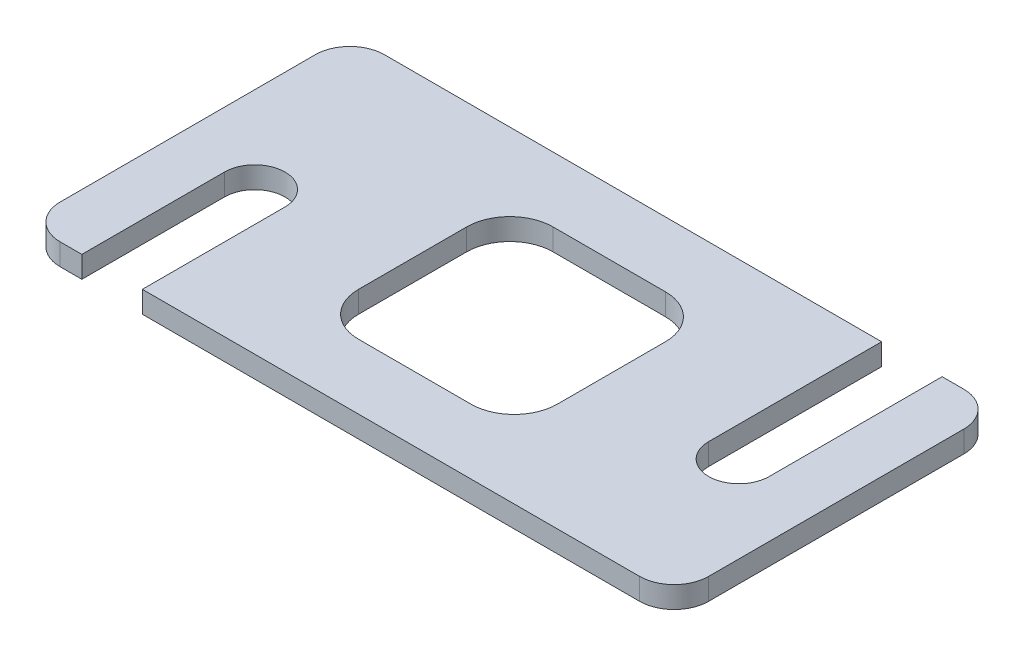
ISO-10303-21;
HEADER;
FILE_DESCRIPTION(('STEP AP214'),'2;1');
FILE_NAME('part.step','',(''),(''),'','','');
FILE_SCHEMA(('AUTOMOTIVE_DESIGN { 1 0 10303 214 1 1 1 1 }'));
ENDSEC;
DATA;
#1=APPLICATION_CONTEXT('core data for automotive mechanical design processes');
#2=APPLICATION_PROTOCOL_DEFINITION('international standard','automotive_design',2000,#1);
#3=PRODUCT_CONTEXT('',#1,'mechanical');
#4=PRODUCT('Part','Part','',(#3));
#5=PRODUCT_RELATED_PRODUCT_CATEGORY('part','',(#4));
#6=PRODUCT_DEFINITION_FORMATION('','',#4);
#7=PRODUCT_DEFINITION_CONTEXT('part definition',#1,'design');
#8=PRODUCT_DEFINITION('design','',#6,#7);
#9=PRODUCT_DEFINITION_SHAPE('','',#8);
#10=(LENGTH_UNIT() NAMED_UNIT(*) SI_UNIT(.MILLI.,.METRE.));
#11=(NAMED_UNIT(*) PLANE_ANGLE_UNIT() SI_UNIT($,.RADIAN.));
#12=(NAMED_UNIT(*) SI_UNIT($,.STERADIAN.) SOLID_ANGLE_UNIT());
#13=UNCERTAINTY_MEASURE_WITH_UNIT(LENGTH_MEASURE(1.E-05),#10,'distance_accuracy_value','');
#14=(GEOMETRIC_REPRESENTATION_CONTEXT(3) GLOBAL_UNCERTAINTY_ASSIGNED_CONTEXT((#13)) GLOBAL_UNIT_ASSIGNED_CONTEXT((#10,
#11,#12)) REPRESENTATION_CONTEXT('',''));
#15=CARTESIAN_POINT('',(0.,0.,0.));
#16=DIRECTION('',(0.,0.,1.));
#17=DIRECTION('',(1.,0.,0.));
#18=AXIS2_PLACEMENT_3D('',#15,#16,#17);
#19=CARTESIAN_POINT('',(0.,5.,-75.));
#20=DIRECTION('',(0.,0.,1.));
#21=DIRECTION('',(1.,0.,0.));
#22=AXIS2_PLACEMENT_3D('',#19,#20,#21);
#23=PLANE('',#22);
#24=DIRECTION('',(-1.,0.,0.));
#25=VECTOR('',#24,1.);
#26=CARTESIAN_POINT('',(0.,5.,-75.));
#27=LINE('',#26,#25);
#28=CARTESIAN_POINT('',(142.,5.,-75.));
#29=VERTEX_POINT('',#28);
#30=CARTESIAN_POINT('',(137.,5.,-75.));
#31=VERTEX_POINT('',#30);
#32=EDGE_CURVE('E248',#29,#31,#27,.T.);
#33=ORIENTED_EDGE('',*,*,#32,.F.);
#34=DIRECTION('',(0.,-1.,0.));
#35=VECTOR('',#34,1.);
#36=CARTESIAN_POINT('',(142.,5.,-75.));
#37=LINE('',#36,#35);
#38=CARTESIAN_POINT('',(142.,0.,-75.));
#39=VERTEX_POINT('',#38);
#40=EDGE_CURVE('E11',#29,#39,#37,.T.);
#41=ORIENTED_EDGE('',*,*,#40,.T.);
#42=DIRECTION('',(-1.,0.,0.));
#43=VECTOR('',#42,1.);
#44=CARTESIAN_POINT('',(0.,0.,-75.));
#45=LINE('',#44,#43);
#46=CARTESIAN_POINT('',(137.,0.,-75.));
#47=VERTEX_POINT('',#46);
#48=EDGE_CURVE('E233',#39,#47,#45,.T.);
#49=ORIENTED_EDGE('',*,*,#48,.T.);
#50=DIRECTION('',(0.,1.,0.));
#51=VECTOR('',#50,1.);
#52=CARTESIAN_POINT('',(137.,0.,-75.));
#53=LINE('',#52,#51);
#54=EDGE_CURVE('E395',#47,#31,#53,.T.);
#55=ORIENTED_EDGE('',*,*,#54,.T.);
#56=EDGE_LOOP('',(#33,#41,#49,#55));
#57=FACE_BOUND('',#56,.T.);
#58=ADVANCED_FACE('F39',(#57),#23,.F.);
#59=CARTESIAN_POINT('',(0.,5.,0.));
#60=DIRECTION('',(0.,0.,-1.));
#61=DIRECTION('',(-1.,0.,0.));
#62=AXIS2_PLACEMENT_3D('',#59,#60,#61);
#63=PLANE('',#62);
#64=DIRECTION('',(1.,0.,0.));
#65=VECTOR('',#64,1.);
#66=CARTESIAN_POINT('',(0.,5.,0.));
#67=LINE('',#66,#65);
#68=CARTESIAN_POINT('',(8.,5.,0.));
#69=VERTEX_POINT('',#68);
#70=CARTESIAN_POINT('',(13.,5.,0.));
#71=VERTEX_POINT('',#70);
#72=EDGE_CURVE('E345',#69,#71,#67,.T.);
#73=ORIENTED_EDGE('',*,*,#72,.F.);
#74=DIRECTION('',(0.,-1.,0.));
#75=VECTOR('',#74,1.);
#76=CARTESIAN_POINT('',(8.,5.,0.));
#77=LINE('',#76,#75);
#78=CARTESIAN_POINT('',(8.,0.,0.));
#79=VERTEX_POINT('',#78);
#80=EDGE_CURVE('E48',#69,#79,#77,.T.);
#81=ORIENTED_EDGE('',*,*,#80,.T.);
#82=DIRECTION('',(1.,0.,0.));
#83=VECTOR('',#82,1.);
#84=CARTESIAN_POINT('',(0.,0.,0.));
#85=LINE('',#84,#83);
#86=CARTESIAN_POINT('',(13.,0.,0.));
#87=VERTEX_POINT('',#86);
#88=EDGE_CURVE('E240',#79,#87,#85,.T.);
#89=ORIENTED_EDGE('',*,*,#88,.T.);
#90=DIRECTION('',(0.,1.,0.));
#91=VECTOR('',#90,1.);
#92=CARTESIAN_POINT('',(13.,0.,0.));
#93=LINE('',#92,#91);
#94=EDGE_CURVE('E359',#87,#71,#93,.T.);
#95=ORIENTED_EDGE('',*,*,#94,.T.);
#96=EDGE_LOOP('',(#73,#81,#89,#95));
#97=FACE_BOUND('',#96,.T.);
#98=ADVANCED_FACE('F342',(#97),#63,.F.);
#99=CARTESIAN_POINT('',(0.,5.,0.));
#100=DIRECTION('',(1.,0.,0.));
#101=DIRECTION('',(0.,0.,-1.));
#102=AXIS2_PLACEMENT_3D('',#99,#100,#101);
#103=PLANE('',#102);
#104=DIRECTION('',(0.,0.,1.));
#105=VECTOR('',#104,1.);
#106=CARTESIAN_POINT('',(0.,5.,0.));
#107=LINE('',#106,#105);
#108=CARTESIAN_POINT('',(0.,5.,-67.));
#109=VERTEX_POINT('',#108);
#110=CARTESIAN_POINT('',(0.,5.,-8.));
#111=VERTEX_POINT('',#110);
#112=EDGE_CURVE('E238',#109,#111,#107,.T.);
#113=ORIENTED_EDGE('',*,*,#112,.F.);
#114=DIRECTION('',(0.,-1.,0.));
#115=VECTOR('',#114,1.);
#116=CARTESIAN_POINT('',(0.,5.,-67.));
#117=LINE('',#116,#115);
#118=CARTESIAN_POINT('',(0.,0.,-67.));
#119=VERTEX_POINT('',#118);
#120=EDGE_CURVE('E331',#109,#119,#117,.T.);
#121=ORIENTED_EDGE('',*,*,#120,.T.);
#122=DIRECTION('',(0.,0.,1.));
#123=VECTOR('',#122,1.);
#124=CARTESIAN_POINT('',(0.,0.,0.));
#125=LINE('',#124,#123);
#126=CARTESIAN_POINT('',(0.,0.,-8.));
#127=VERTEX_POINT('',#126);
#128=EDGE_CURVE('E355',#119,#127,#125,.T.);
#129=ORIENTED_EDGE('',*,*,#128,.T.);
#130=DIRECTION('',(0.,-1.,0.));
#131=VECTOR('',#130,1.);
#132=CARTESIAN_POINT('',(0.,5.,-8.));
#133=LINE('',#132,#131);
#134=EDGE_CURVE('E63',#127,#111,#133,.F.);
#135=ORIENTED_EDGE('',*,*,#134,.T.);
#136=EDGE_LOOP('',(#113,#121,#129,#135));
#137=FACE_BOUND('',#136,.T.);
#138=ADVANCED_FACE('F514',(#137),#103,.F.);
#139=CARTESIAN_POINT('',(27.,0.,0.));
#140=VERTEX_POINT('',#139);
#141=CARTESIAN_POINT('',(142.,0.,0.));
#142=VERTEX_POINT('',#141);
#143=EDGE_CURVE('E352',#140,#142,#85,.T.);
#144=ORIENTED_EDGE('',*,*,#143,.T.);
#145=DIRECTION('',(0.,-1.,0.));
#146=VECTOR('',#145,1.);
#147=CARTESIAN_POINT('',(142.,5.,0.));
#148=LINE('',#147,#146);
#149=CARTESIAN_POINT('',(142.,5.,0.));
#150=VERTEX_POINT('',#149);
#151=EDGE_CURVE('E315',#142,#150,#148,.F.);
#152=ORIENTED_EDGE('',*,*,#151,.T.);
#153=CARTESIAN_POINT('',(27.,5.,0.));
#154=VERTEX_POINT('',#153);
#155=EDGE_CURVE('E368',#154,#150,#67,.T.);
#156=ORIENTED_EDGE('',*,*,#155,.F.);
#157=DIRECTION('',(0.,1.,0.));
#158=VECTOR('',#157,1.);
#159=CARTESIAN_POINT('',(27.,0.,0.));
#160=LINE('',#159,#158);
#161=EDGE_CURVE('E371',#140,#154,#160,.T.);
#162=ORIENTED_EDGE('',*,*,#161,.F.);
#163=EDGE_LOOP('',(#144,#152,#156,#162));
#164=FACE_BOUND('',#163,.T.);
#165=ADVANCED_FACE('F516',(#164),#63,.F.);
#166=CARTESIAN_POINT('',(150.,5.,0.));
#167=DIRECTION('',(-1.,0.,0.));
#168=DIRECTION('',(0.,0.,1.));
#169=AXIS2_PLACEMENT_3D('',#166,#167,#168);
#170=PLANE('',#169);
#171=DIRECTION('',(0.,0.,-1.));
#172=VECTOR('',#171,1.);
#173=CARTESIAN_POINT('',(150.,5.,0.));
#174=LINE('',#173,#172);
#175=CARTESIAN_POINT('',(150.,5.,-8.));
#176=VERTEX_POINT('',#175);
#177=CARTESIAN_POINT('',(150.,5.,-67.));
#178=VERTEX_POINT('',#177);
#179=EDGE_CURVE('E362',#176,#178,#174,.T.);
#180=ORIENTED_EDGE('',*,*,#179,.F.);
#181=DIRECTION('',(0.,-1.,0.));
#182=VECTOR('',#181,1.);
#183=CARTESIAN_POINT('',(150.,5.,-8.));
#184=LINE('',#183,#182);
#185=CARTESIAN_POINT('',(150.,0.,-8.));
#186=VERTEX_POINT('',#185);
#187=EDGE_CURVE('E300',#176,#186,#184,.T.);
#188=ORIENTED_EDGE('',*,*,#187,.T.);
#189=DIRECTION('',(0.,0.,-1.));
#190=VECTOR('',#189,1.);
#191=CARTESIAN_POINT('',(150.,0.,0.));
#192=LINE('',#191,#190);
#193=CARTESIAN_POINT('',(150.,0.,-67.));
#194=VERTEX_POINT('',#193);
#195=EDGE_CURVE('E234',#186,#194,#192,.T.);
#196=ORIENTED_EDGE('',*,*,#195,.T.);
#197=DIRECTION('',(0.,-1.,0.));
#198=VECTOR('',#197,1.);
#199=CARTESIAN_POINT('',(150.,5.,-67.));
#200=LINE('',#199,#198);
#201=EDGE_CURVE('E297',#194,#178,#200,.F.);
#202=ORIENTED_EDGE('',*,*,#201,.T.);
#203=EDGE_LOOP('',(#180,#188,#196,#202));
#204=FACE_BOUND('',#203,.T.);
#205=ADVANCED_FACE('F521',(#204),#170,.F.);
#206=CARTESIAN_POINT('',(123.,0.,-75.));
#207=VERTEX_POINT('',#206);
#208=CARTESIAN_POINT('',(8.,0.,-75.));
#209=VERTEX_POINT('',#208);
#210=EDGE_CURVE('E221',#207,#209,#45,.T.);
#211=ORIENTED_EDGE('',*,*,#210,.T.);
#212=DIRECTION('',(0.,-1.,0.));
#213=VECTOR('',#212,1.);
#214=CARTESIAN_POINT('',(8.,5.,-75.));
#215=LINE('',#214,#213);
#216=CARTESIAN_POINT('',(8.,5.,-75.));
#217=VERTEX_POINT('',#216);
#218=EDGE_CURVE('E335',#209,#217,#215,.F.);
#219=ORIENTED_EDGE('',*,*,#218,.T.);
#220=CARTESIAN_POINT('',(123.,5.,-75.));
#221=VERTEX_POINT('',#220);
#222=EDGE_CURVE('E224',#221,#217,#27,.T.);
#223=ORIENTED_EDGE('',*,*,#222,.F.);
#224=DIRECTION('',(0.,1.,0.));
#225=VECTOR('',#224,1.);
#226=CARTESIAN_POINT('',(123.,0.,-75.));
#227=LINE('',#226,#225);
#228=EDGE_CURVE('E207',#207,#221,#227,.T.);
#229=ORIENTED_EDGE('',*,*,#228,.F.);
#230=EDGE_LOOP('',(#211,#219,#223,#229));
#231=FACE_BOUND('',#230,.T.);
#232=ADVANCED_FACE('F220',(#231),#23,.F.);
#233=CARTESIAN_POINT('',(0.,5.,0.));
#234=DIRECTION('',(0.,-1.,0.));
#235=DIRECTION('',(0.,0.,-1.));
#236=AXIS2_PLACEMENT_3D('',#233,#234,#235);
#237=PLANE('',#236);
#238=DIRECTION('',(1.,0.,0.));
#239=VECTOR('',#238,1.);
#240=CARTESIAN_POINT('',(52.,5.,-15.));
#241=LINE('',#240,#239);
#242=CARTESIAN_POINT('',(62.,5.,-15.));
#243=VERTEX_POINT('',#242);
#244=CARTESIAN_POINT('',(88.,5.,-15.));
#245=VERTEX_POINT('',#244);
#246=EDGE_CURVE('E437',#243,#245,#241,.T.);
#247=ORIENTED_EDGE('',*,*,#246,.F.);
#248=CARTESIAN_POINT('',(62.,5.,-25.));
#249=DIRECTION('',(0.,-1.,0.));
#250=DIRECTION('',(0.,0.,-1.));
#251=AXIS2_PLACEMENT_3D('',#248,#249,#250);
#252=CIRCLE('',#251,10.);
#253=CARTESIAN_POINT('',(52.,5.,-25.));
#254=VERTEX_POINT('',#253);
#255=EDGE_CURVE('E279',#243,#254,#252,.T.);
#256=ORIENTED_EDGE('',*,*,#255,.T.);
#257=DIRECTION('',(0.,0.,1.));
#258=VECTOR('',#257,1.);
#259=CARTESIAN_POINT('',(52.,5.,-15.));
#260=LINE('',#259,#258);
#261=CARTESIAN_POINT('',(52.,5.,-50.));
#262=VERTEX_POINT('',#261);
#263=EDGE_CURVE('E441',#262,#254,#260,.T.);
#264=ORIENTED_EDGE('',*,*,#263,.F.);
#265=CARTESIAN_POINT('',(62.,5.,-50.));
#266=DIRECTION('',(0.,-1.,0.));
#267=DIRECTION('',(0.,0.,-1.));
#268=AXIS2_PLACEMENT_3D('',#265,#266,#267);
#269=CIRCLE('',#268,10.);
#270=CARTESIAN_POINT('',(62.,5.,-60.));
#271=VERTEX_POINT('',#270);
#272=EDGE_CURVE('E273',#262,#271,#269,.T.);
#273=ORIENTED_EDGE('',*,*,#272,.T.);
#274=DIRECTION('',(-1.,0.,0.));
#275=VECTOR('',#274,1.);
#276=CARTESIAN_POINT('',(52.,5.,-60.));
#277=LINE('',#276,#275);
#278=CARTESIAN_POINT('',(88.,5.,-60.));
#279=VERTEX_POINT('',#278);
#280=EDGE_CURVE('E428',#279,#271,#277,.T.);
#281=ORIENTED_EDGE('',*,*,#280,.F.);
#282=CARTESIAN_POINT('',(88.,5.,-50.));
#283=DIRECTION('',(0.,-1.,0.));
#284=DIRECTION('',(0.,0.,-1.));
#285=AXIS2_PLACEMENT_3D('',#282,#283,#284);
#286=CIRCLE('',#285,10.);
#287=CARTESIAN_POINT('',(98.,5.,-50.));
#288=VERTEX_POINT('',#287);
#289=EDGE_CURVE('E291',#279,#288,#286,.T.);
#290=ORIENTED_EDGE('',*,*,#289,.T.);
#291=DIRECTION('',(0.,0.,-1.));
#292=VECTOR('',#291,1.);
#293=CARTESIAN_POINT('',(98.,5.,-15.));
#294=LINE('',#293,#292);
#295=CARTESIAN_POINT('',(98.,5.,-25.));
#296=VERTEX_POINT('',#295);
#297=EDGE_CURVE('E433',#296,#288,#294,.T.);
#298=ORIENTED_EDGE('',*,*,#297,.F.);
#299=CARTESIAN_POINT('',(88.,5.,-25.));
#300=DIRECTION('',(0.,-1.,0.));
#301=DIRECTION('',(0.,0.,-1.));
#302=AXIS2_PLACEMENT_3D('',#299,#300,#301);
#303=CIRCLE('',#302,10.);
#304=EDGE_CURVE('E285',#296,#245,#303,.T.);
#305=ORIENTED_EDGE('',*,*,#304,.T.);
#306=EDGE_LOOP('',(#247,#256,#264,#273,#281,#290,#298,#305));
#307=FACE_BOUND('',#306,.T.);
#308=ORIENTED_EDGE('',*,*,#155,.T.);
#309=CARTESIAN_POINT('',(142.,5.,-8.));
#310=DIRECTION('',(0.,-1.,0.));
#311=DIRECTION('',(0.,0.,-1.));
#312=AXIS2_PLACEMENT_3D('',#309,#310,#311);
#313=CIRCLE('',#312,8.);
#314=EDGE_CURVE('E326',#150,#176,#313,.F.);
#315=ORIENTED_EDGE('',*,*,#314,.T.);
#316=ORIENTED_EDGE('',*,*,#179,.T.);
#317=CARTESIAN_POINT('',(142.,5.,-67.));
#318=DIRECTION('',(0.,-1.,0.));
#319=DIRECTION('',(0.,0.,-1.));
#320=AXIS2_PLACEMENT_3D('',#317,#318,#319);
#321=CIRCLE('',#320,8.);
#322=EDGE_CURVE('E318',#178,#29,#321,.F.);
#323=ORIENTED_EDGE('',*,*,#322,.T.);
#324=ORIENTED_EDGE('',*,*,#32,.T.);
#325=DIRECTION('',(0.,0.,-1.));
#326=VECTOR('',#325,1.);
#327=CARTESIAN_POINT('',(137.,5.,-75.));
#328=LINE('',#327,#326);
#329=CARTESIAN_POINT('',(137.,5.,-35.));
#330=VERTEX_POINT('',#329);
#331=EDGE_CURVE('E215',#330,#31,#328,.T.);
#332=ORIENTED_EDGE('',*,*,#331,.F.);
#333=CARTESIAN_POINT('',(130.,5.,-35.));
#334=DIRECTION('',(0.,1.,0.));
#335=DIRECTION('',(0.,0.,-1.));
#336=AXIS2_PLACEMENT_3D('',#333,#334,#335);
#337=CIRCLE('',#336,7.00000000000001);
#338=CARTESIAN_POINT('',(123.,5.,-35.));
#339=VERTEX_POINT('',#338);
#340=EDGE_CURVE('E415',#339,#330,#337,.T.);
#341=ORIENTED_EDGE('',*,*,#340,.F.);
#342=DIRECTION('',(0.,0.,1.));
#343=VECTOR('',#342,1.);
#344=CARTESIAN_POINT('',(123.,5.,-35.));
#345=LINE('',#344,#343);
#346=EDGE_CURVE('E419',#221,#339,#345,.T.);
#347=ORIENTED_EDGE('',*,*,#346,.F.);
#348=ORIENTED_EDGE('',*,*,#222,.T.);
#349=CARTESIAN_POINT('',(8.,5.,-67.));
#350=DIRECTION('',(0.,-1.,0.));
#351=DIRECTION('',(0.,0.,-1.));
#352=AXIS2_PLACEMENT_3D('',#349,#350,#351);
#353=CIRCLE('',#352,8.);
#354=EDGE_CURVE('E323',#217,#109,#353,.F.);
#355=ORIENTED_EDGE('',*,*,#354,.T.);
#356=ORIENTED_EDGE('',*,*,#112,.T.);
#357=CARTESIAN_POINT('',(8.,5.,-8.));
#358=DIRECTION('',(0.,-1.,0.));
#359=DIRECTION('',(0.,0.,-1.));
#360=AXIS2_PLACEMENT_3D('',#357,#358,#359);
#361=CIRCLE('',#360,8.);
#362=EDGE_CURVE('E55',#111,#69,#361,.F.);
#363=ORIENTED_EDGE('',*,*,#362,.T.);
#364=ORIENTED_EDGE('',*,*,#72,.T.);
#365=DIRECTION('',(0.,0.,1.));
#366=VECTOR('',#365,1.);
#367=CARTESIAN_POINT('',(13.,5.,0.));
#368=LINE('',#367,#366);
#369=CARTESIAN_POINT('',(13.,5.,-33.));
#370=VERTEX_POINT('',#369);
#371=EDGE_CURVE('E382',#370,#71,#368,.T.);
#372=ORIENTED_EDGE('',*,*,#371,.F.);
#373=CARTESIAN_POINT('',(20.,5.,-33.));
#374=DIRECTION('',(0.,1.,0.));
#375=DIRECTION('',(0.,0.,-1.));
#376=AXIS2_PLACEMENT_3D('',#373,#374,#375);
#377=CIRCLE('',#376,7.);
#378=CARTESIAN_POINT('',(27.,5.,-33.));
#379=VERTEX_POINT('',#378);
#380=EDGE_CURVE('E387',#379,#370,#377,.T.);
#381=ORIENTED_EDGE('',*,*,#380,.F.);
#382=DIRECTION('',(0.,0.,-1.));
#383=VECTOR('',#382,1.);
#384=CARTESIAN_POINT('',(27.,5.,-33.));
#385=LINE('',#384,#383);
#386=EDGE_CURVE('E391',#154,#379,#385,.T.);
#387=ORIENTED_EDGE('',*,*,#386,.F.);
#388=EDGE_LOOP('',(#308,#315,#316,#323,#324,#332,#341,#347,#348,#355,#356,#363,#364,#372,#381,#387));
#389=FACE_BOUND('',#388,.T.);
#390=ADVANCED_FACE('F474',(#307,#389),#237,.F.);
#391=CARTESIAN_POINT('',(0.,0.,0.));
#392=DIRECTION('',(0.,-1.,0.));
#393=DIRECTION('',(0.,0.,-1.));
#394=AXIS2_PLACEMENT_3D('',#391,#392,#393);
#395=PLANE('',#394);
#396=DIRECTION('',(-1.,0.,0.));
#397=VECTOR('',#396,1.);
#398=CARTESIAN_POINT('',(52.,0.,-60.));
#399=LINE('',#398,#397);
#400=CARTESIAN_POINT('',(88.,0.,-60.));
#401=VERTEX_POINT('',#400);
#402=CARTESIAN_POINT('',(62.,0.,-60.));
#403=VERTEX_POINT('',#402);
#404=EDGE_CURVE('E422',#401,#403,#399,.T.);
#405=ORIENTED_EDGE('',*,*,#404,.T.);
#406=CARTESIAN_POINT('',(62.,0.,-50.));
#407=DIRECTION('',(0.,-1.,0.));
#408=DIRECTION('',(0.,0.,-1.));
#409=AXIS2_PLACEMENT_3D('',#406,#407,#408);
#410=CIRCLE('',#409,10.);
#411=CARTESIAN_POINT('',(52.,0.,-50.));
#412=VERTEX_POINT('',#411);
#413=EDGE_CURVE('E276',#403,#412,#410,.F.);
#414=ORIENTED_EDGE('',*,*,#413,.T.);
#415=DIRECTION('',(0.,0.,1.));
#416=VECTOR('',#415,1.);
#417=CARTESIAN_POINT('',(52.,0.,-15.));
#418=LINE('',#417,#416);
#419=CARTESIAN_POINT('',(52.,0.,-25.));
#420=VERTEX_POINT('',#419);
#421=EDGE_CURVE('E432',#412,#420,#418,.T.);
#422=ORIENTED_EDGE('',*,*,#421,.T.);
#423=CARTESIAN_POINT('',(62.,0.,-25.));
#424=DIRECTION('',(0.,-1.,0.));
#425=DIRECTION('',(0.,0.,-1.));
#426=AXIS2_PLACEMENT_3D('',#423,#424,#425);
#427=CIRCLE('',#426,10.);
#428=CARTESIAN_POINT('',(62.,0.,-15.));
#429=VERTEX_POINT('',#428);
#430=EDGE_CURVE('E282',#420,#429,#427,.F.);
#431=ORIENTED_EDGE('',*,*,#430,.T.);
#432=DIRECTION('',(1.,0.,0.));
#433=VECTOR('',#432,1.);
#434=CARTESIAN_POINT('',(52.,0.,-15.));
#435=LINE('',#434,#433);
#436=CARTESIAN_POINT('',(88.,0.,-15.));
#437=VERTEX_POINT('',#436);
#438=EDGE_CURVE('E452',#429,#437,#435,.T.);
#439=ORIENTED_EDGE('',*,*,#438,.T.);
#440=CARTESIAN_POINT('',(88.,0.,-25.));
#441=DIRECTION('',(0.,-1.,0.));
#442=DIRECTION('',(0.,0.,-1.));
#443=AXIS2_PLACEMENT_3D('',#440,#441,#442);
#444=CIRCLE('',#443,10.);
#445=CARTESIAN_POINT('',(98.,0.,-25.));
#446=VERTEX_POINT('',#445);
#447=EDGE_CURVE('E288',#437,#446,#444,.F.);
#448=ORIENTED_EDGE('',*,*,#447,.T.);
#449=DIRECTION('',(0.,0.,-1.));
#450=VECTOR('',#449,1.);
#451=CARTESIAN_POINT('',(98.,0.,-15.));
#452=LINE('',#451,#450);
#453=CARTESIAN_POINT('',(98.,0.,-50.));
#454=VERTEX_POINT('',#453);
#455=EDGE_CURVE('E448',#446,#454,#452,.T.);
#456=ORIENTED_EDGE('',*,*,#455,.T.);
#457=CARTESIAN_POINT('',(88.,0.,-50.));
#458=DIRECTION('',(0.,-1.,0.));
#459=DIRECTION('',(0.,0.,-1.));
#460=AXIS2_PLACEMENT_3D('',#457,#458,#459);
#461=CIRCLE('',#460,10.);
#462=EDGE_CURVE('E294',#454,#401,#461,.F.);
#463=ORIENTED_EDGE('',*,*,#462,.T.);
#464=EDGE_LOOP('',(#405,#414,#422,#431,#439,#448,#456,#463));
#465=FACE_BOUND('',#464,.T.);
#466=ORIENTED_EDGE('',*,*,#195,.F.);
#467=CARTESIAN_POINT('',(142.,0.,-8.));
#468=DIRECTION('',(0.,-1.,0.));
#469=DIRECTION('',(0.,0.,-1.));
#470=AXIS2_PLACEMENT_3D('',#467,#468,#469);
#471=CIRCLE('',#470,8.);
#472=EDGE_CURVE('E312',#186,#142,#471,.T.);
#473=ORIENTED_EDGE('',*,*,#472,.T.);
#474=ORIENTED_EDGE('',*,*,#143,.F.);
#475=DIRECTION('',(0.,0.,-1.));
#476=VECTOR('',#475,1.);
#477=CARTESIAN_POINT('',(27.,0.,-33.));
#478=LINE('',#477,#476);
#479=CARTESIAN_POINT('',(27.,0.,-33.));
#480=VERTEX_POINT('',#479);
#481=EDGE_CURVE('E386',#140,#480,#478,.T.);
#482=ORIENTED_EDGE('',*,*,#481,.T.);
#483=CARTESIAN_POINT('',(20.,0.,-33.));
#484=DIRECTION('',(0.,1.,0.));
#485=DIRECTION('',(0.,0.,-1.));
#486=AXIS2_PLACEMENT_3D('',#483,#484,#485);
#487=CIRCLE('',#486,7.);
#488=CARTESIAN_POINT('',(13.,0.,-33.));
#489=VERTEX_POINT('',#488);
#490=EDGE_CURVE('E398',#480,#489,#487,.T.);
#491=ORIENTED_EDGE('',*,*,#490,.T.);
#492=DIRECTION('',(0.,0.,1.));
#493=VECTOR('',#492,1.);
#494=CARTESIAN_POINT('',(13.,0.,0.));
#495=LINE('',#494,#493);
#496=EDGE_CURVE('E350',#489,#87,#495,.T.);
#497=ORIENTED_EDGE('',*,*,#496,.T.);
#498=ORIENTED_EDGE('',*,*,#88,.F.);
#499=CARTESIAN_POINT('',(8.,0.,-8.));
#500=DIRECTION('',(0.,-1.,0.));
#501=DIRECTION('',(0.,0.,-1.));
#502=AXIS2_PLACEMENT_3D('',#499,#500,#501);
#503=CIRCLE('',#502,8.);
#504=EDGE_CURVE('E307',#79,#127,#503,.T.);
#505=ORIENTED_EDGE('',*,*,#504,.T.);
#506=ORIENTED_EDGE('',*,*,#128,.F.);
#507=CARTESIAN_POINT('',(8.,0.,-67.));
#508=DIRECTION('',(0.,-1.,0.));
#509=DIRECTION('',(0.,0.,-1.));
#510=AXIS2_PLACEMENT_3D('',#507,#508,#509);
#511=CIRCLE('',#510,8.);
#512=EDGE_CURVE('E231',#119,#209,#511,.T.);
#513=ORIENTED_EDGE('',*,*,#512,.T.);
#514=ORIENTED_EDGE('',*,*,#210,.F.);
#515=DIRECTION('',(0.,0.,1.));
#516=VECTOR('',#515,1.);
#517=CARTESIAN_POINT('',(123.,0.,-35.));
#518=LINE('',#517,#516);
#519=CARTESIAN_POINT('',(123.,0.,-35.));
#520=VERTEX_POINT('',#519);
#521=EDGE_CURVE('E203',#207,#520,#518,.T.);
#522=ORIENTED_EDGE('',*,*,#521,.T.);
#523=CARTESIAN_POINT('',(130.,0.,-35.));
#524=DIRECTION('',(0.,1.,0.));
#525=DIRECTION('',(0.,0.,-1.));
#526=AXIS2_PLACEMENT_3D('',#523,#524,#525);
#527=CIRCLE('',#526,7.00000000000001);
#528=CARTESIAN_POINT('',(137.,0.,-35.));
#529=VERTEX_POINT('',#528);
#530=EDGE_CURVE('E214',#520,#529,#527,.T.);
#531=ORIENTED_EDGE('',*,*,#530,.T.);
#532=DIRECTION('',(0.,0.,-1.));
#533=VECTOR('',#532,1.);
#534=CARTESIAN_POINT('',(137.,0.,-75.));
#535=LINE('',#534,#533);
#536=EDGE_CURVE('E226',#529,#47,#535,.T.);
#537=ORIENTED_EDGE('',*,*,#536,.T.);
#538=ORIENTED_EDGE('',*,*,#48,.F.);
#539=CARTESIAN_POINT('',(142.,0.,-67.));
#540=DIRECTION('',(0.,-1.,0.));
#541=DIRECTION('',(0.,0.,-1.));
#542=AXIS2_PLACEMENT_3D('',#539,#540,#541);
#543=CIRCLE('',#542,8.);
#544=EDGE_CURVE('E304',#39,#194,#543,.T.);
#545=ORIENTED_EDGE('',*,*,#544,.T.);
#546=EDGE_LOOP('',(#466,#473,#474,#482,#491,#497,#498,#505,#506,#513,#514,#522,#531,#537,#538,#545));
#547=FACE_BOUND('',#546,.T.);
#548=ADVANCED_FACE('F229',(#465,#547),#395,.T.);
#549=CARTESIAN_POINT('',(13.,0.,0.));
#550=DIRECTION('',(-1.,0.,0.));
#551=DIRECTION('',(0.,0.,1.));
#552=AXIS2_PLACEMENT_3D('',#549,#550,#551);
#553=PLANE('',#552);
#554=ORIENTED_EDGE('',*,*,#371,.T.);
#555=ORIENTED_EDGE('',*,*,#94,.F.);
#556=ORIENTED_EDGE('',*,*,#496,.F.);
#557=DIRECTION('',(0.,1.,0.));
#558=VECTOR('',#557,1.);
#559=CARTESIAN_POINT('',(13.,0.,-33.));
#560=LINE('',#559,#558);
#561=EDGE_CURVE('E377',#489,#370,#560,.T.);
#562=ORIENTED_EDGE('',*,*,#561,.T.);
#563=EDGE_LOOP('',(#554,#555,#556,#562));
#564=FACE_BOUND('',#563,.T.);
#565=ADVANCED_FACE('F590',(#564),#553,.F.);
#566=CARTESIAN_POINT('',(20.,0.,-33.));
#567=DIRECTION('',(0.,1.,0.));
#568=DIRECTION('',(0.,0.,1.));
#569=AXIS2_PLACEMENT_3D('',#566,#567,#568);
#570=CYLINDRICAL_SURFACE('',#569,7.);
#571=ORIENTED_EDGE('',*,*,#380,.T.);
#572=ORIENTED_EDGE('',*,*,#561,.F.);
#573=ORIENTED_EDGE('',*,*,#490,.F.);
#574=DIRECTION('',(0.,1.,0.));
#575=VECTOR('',#574,1.);
#576=CARTESIAN_POINT('',(27.,0.,-33.));
#577=LINE('',#576,#575);
#578=EDGE_CURVE('E374',#480,#379,#577,.T.);
#579=ORIENTED_EDGE('',*,*,#578,.T.);
#580=EDGE_LOOP('',(#571,#572,#573,#579));
#581=FACE_BOUND('',#580,.T.);
#582=ADVANCED_FACE('F587',(#581),#570,.F.);
#583=CARTESIAN_POINT('',(27.,0.,-33.));
#584=DIRECTION('',(1.,0.,0.));
#585=DIRECTION('',(0.,0.,-1.));
#586=AXIS2_PLACEMENT_3D('',#583,#584,#585);
#587=PLANE('',#586);
#588=ORIENTED_EDGE('',*,*,#386,.T.);
#589=ORIENTED_EDGE('',*,*,#578,.F.);
#590=ORIENTED_EDGE('',*,*,#481,.F.);
#591=ORIENTED_EDGE('',*,*,#161,.T.);
#592=EDGE_LOOP('',(#588,#589,#590,#591));
#593=FACE_BOUND('',#592,.T.);
#594=ADVANCED_FACE('F584',(#593),#587,.F.);
#595=CARTESIAN_POINT('',(137.,0.,-75.));
#596=DIRECTION('',(1.,0.,0.));
#597=DIRECTION('',(0.,0.,-1.));
#598=AXIS2_PLACEMENT_3D('',#595,#596,#597);
#599=PLANE('',#598);
#600=ORIENTED_EDGE('',*,*,#331,.T.);
#601=ORIENTED_EDGE('',*,*,#54,.F.);
#602=ORIENTED_EDGE('',*,*,#536,.F.);
#603=DIRECTION('',(0.,1.,0.));
#604=VECTOR('',#603,1.);
#605=CARTESIAN_POINT('',(137.,0.,-35.));
#606=LINE('',#605,#604);
#607=EDGE_CURVE('E406',#529,#330,#606,.T.);
#608=ORIENTED_EDGE('',*,*,#607,.T.);
#609=EDGE_LOOP('',(#600,#601,#602,#608));
#610=FACE_BOUND('',#609,.T.);
#611=ADVANCED_FACE('F568',(#610),#599,.F.);
#612=CARTESIAN_POINT('',(130.,0.,-35.));
#613=DIRECTION('',(0.,1.,0.));
#614=DIRECTION('',(0.,0.,1.));
#615=AXIS2_PLACEMENT_3D('',#612,#613,#614);
#616=CYLINDRICAL_SURFACE('',#615,7.00000000000001);
#617=ORIENTED_EDGE('',*,*,#340,.T.);
#618=ORIENTED_EDGE('',*,*,#607,.F.);
#619=ORIENTED_EDGE('',*,*,#530,.F.);
#620=DIRECTION('',(0.,1.,0.));
#621=VECTOR('',#620,1.);
#622=CARTESIAN_POINT('',(123.,0.,-35.));
#623=LINE('',#622,#621);
#624=EDGE_CURVE('E209',#520,#339,#623,.T.);
#625=ORIENTED_EDGE('',*,*,#624,.T.);
#626=EDGE_LOOP('',(#617,#618,#619,#625));
#627=FACE_BOUND('',#626,.T.);
#628=ADVANCED_FACE('F504',(#627),#616,.F.);
#629=CARTESIAN_POINT('',(123.,0.,-35.));
#630=DIRECTION('',(-1.,0.,0.));
#631=DIRECTION('',(0.,0.,1.));
#632=AXIS2_PLACEMENT_3D('',#629,#630,#631);
#633=PLANE('',#632);
#634=ORIENTED_EDGE('',*,*,#346,.T.);
#635=ORIENTED_EDGE('',*,*,#624,.F.);
#636=ORIENTED_EDGE('',*,*,#521,.F.);
#637=ORIENTED_EDGE('',*,*,#228,.T.);
#638=EDGE_LOOP('',(#634,#635,#636,#637));
#639=FACE_BOUND('',#638,.T.);
#640=ADVANCED_FACE('F206',(#639),#633,.F.);
#641=CARTESIAN_POINT('',(52.,0.,-15.));
#642=DIRECTION('',(-1.,0.,0.));
#643=DIRECTION('',(0.,0.,1.));
#644=AXIS2_PLACEMENT_3D('',#641,#642,#643);
#645=PLANE('',#644);
#646=ORIENTED_EDGE('',*,*,#421,.F.);
#647=DIRECTION('',(0.,1.,0.));
#648=VECTOR('',#647,1.);
#649=CARTESIAN_POINT('',(52.,5.,-50.));
#650=LINE('',#649,#648);
#651=EDGE_CURVE('E247',#412,#262,#650,.T.);
#652=ORIENTED_EDGE('',*,*,#651,.T.);
#653=ORIENTED_EDGE('',*,*,#263,.T.);
#654=DIRECTION('',(0.,1.,0.));
#655=VECTOR('',#654,1.);
#656=CARTESIAN_POINT('',(52.,0.,-25.));
#657=LINE('',#656,#655);
#658=EDGE_CURVE('E244',#254,#420,#657,.F.);
#659=ORIENTED_EDGE('',*,*,#658,.T.);
#660=EDGE_LOOP('',(#646,#652,#653,#659));
#661=FACE_BOUND('',#660,.T.);
#662=ADVANCED_FACE('F496',(#661),#645,.F.);
#663=CARTESIAN_POINT('',(52.,0.,-60.));
#664=DIRECTION('',(0.,0.,-1.));
#665=DIRECTION('',(-1.,0.,0.));
#666=AXIS2_PLACEMENT_3D('',#663,#664,#665);
#667=PLANE('',#666);
#668=ORIENTED_EDGE('',*,*,#280,.T.);
#669=DIRECTION('',(0.,1.,0.));
#670=VECTOR('',#669,1.);
#671=CARTESIAN_POINT('',(62.,0.,-60.));
#672=LINE('',#671,#670);
#673=EDGE_CURVE('E256',#271,#403,#672,.F.);
#674=ORIENTED_EDGE('',*,*,#673,.T.);
#675=ORIENTED_EDGE('',*,*,#404,.F.);
#676=DIRECTION('',(0.,1.,0.));
#677=VECTOR('',#676,1.);
#678=CARTESIAN_POINT('',(88.,5.,-60.));
#679=LINE('',#678,#677);
#680=EDGE_CURVE('E252',#401,#279,#679,.T.);
#681=ORIENTED_EDGE('',*,*,#680,.T.);
#682=EDGE_LOOP('',(#668,#674,#675,#681));
#683=FACE_BOUND('',#682,.T.);
#684=ADVANCED_FACE('F492',(#683),#667,.F.);
#685=CARTESIAN_POINT('',(98.,0.,-15.));
#686=DIRECTION('',(1.,0.,0.));
#687=DIRECTION('',(0.,0.,-1.));
#688=AXIS2_PLACEMENT_3D('',#685,#686,#687);
#689=PLANE('',#688);
#690=ORIENTED_EDGE('',*,*,#455,.F.);
#691=DIRECTION('',(0.,1.,0.));
#692=VECTOR('',#691,1.);
#693=CARTESIAN_POINT('',(98.,5.,-25.));
#694=LINE('',#693,#692);
#695=EDGE_CURVE('E269',#446,#296,#694,.T.);
#696=ORIENTED_EDGE('',*,*,#695,.T.);
#697=ORIENTED_EDGE('',*,*,#297,.T.);
#698=DIRECTION('',(0.,1.,0.));
#699=VECTOR('',#698,1.);
#700=CARTESIAN_POINT('',(98.,0.,-50.));
#701=LINE('',#700,#699);
#702=EDGE_CURVE('E266',#288,#454,#701,.F.);
#703=ORIENTED_EDGE('',*,*,#702,.T.);
#704=EDGE_LOOP('',(#690,#696,#697,#703));
#705=FACE_BOUND('',#704,.T.);
#706=ADVANCED_FACE('F483',(#705),#689,.F.);
#707=CARTESIAN_POINT('',(52.,0.,-15.));
#708=DIRECTION('',(0.,0.,1.));
#709=DIRECTION('',(1.,0.,0.));
#710=AXIS2_PLACEMENT_3D('',#707,#708,#709);
#711=PLANE('',#710);
#712=ORIENTED_EDGE('',*,*,#438,.F.);
#713=DIRECTION('',(0.,1.,0.));
#714=VECTOR('',#713,1.);
#715=CARTESIAN_POINT('',(62.,5.,-15.));
#716=LINE('',#715,#714);
#717=EDGE_CURVE('E262',#429,#243,#716,.T.);
#718=ORIENTED_EDGE('',*,*,#717,.T.);
#719=ORIENTED_EDGE('',*,*,#246,.T.);
#720=DIRECTION('',(0.,1.,0.));
#721=VECTOR('',#720,1.);
#722=CARTESIAN_POINT('',(88.,0.,-15.));
#723=LINE('',#722,#721);
#724=EDGE_CURVE('E259',#245,#437,#723,.F.);
#725=ORIENTED_EDGE('',*,*,#724,.T.);
#726=EDGE_LOOP('',(#712,#718,#719,#725));
#727=FACE_BOUND('',#726,.T.);
#728=ADVANCED_FACE('F471',(#727),#711,.F.);
#729=CARTESIAN_POINT('',(62.,0.,-50.));
#730=DIRECTION('',(0.,-1.,0.));
#731=DIRECTION('',(0.,0.,-1.));
#732=AXIS2_PLACEMENT_3D('',#729,#730,#731);
#733=CYLINDRICAL_SURFACE('',#732,10.);
#734=ORIENTED_EDGE('',*,*,#413,.F.);
#735=ORIENTED_EDGE('',*,*,#673,.F.);
#736=ORIENTED_EDGE('',*,*,#272,.F.);
#737=ORIENTED_EDGE('',*,*,#651,.F.);
#738=EDGE_LOOP('',(#734,#735,#736,#737));
#739=FACE_BOUND('',#738,.T.);
#740=ADVANCED_FACE('F495',(#739),#733,.F.);
#741=CARTESIAN_POINT('',(62.,0.,-25.));
#742=DIRECTION('',(0.,-1.,0.));
#743=DIRECTION('',(0.,0.,-1.));
#744=AXIS2_PLACEMENT_3D('',#741,#742,#743);
#745=CYLINDRICAL_SURFACE('',#744,10.);
#746=ORIENTED_EDGE('',*,*,#430,.F.);
#747=ORIENTED_EDGE('',*,*,#658,.F.);
#748=ORIENTED_EDGE('',*,*,#255,.F.);
#749=ORIENTED_EDGE('',*,*,#717,.F.);
#750=EDGE_LOOP('',(#746,#747,#748,#749));
#751=FACE_BOUND('',#750,.T.);
#752=ADVANCED_FACE('F468',(#751),#745,.F.);
#753=CARTESIAN_POINT('',(88.,0.,-25.));
#754=DIRECTION('',(0.,-1.,0.));
#755=DIRECTION('',(0.,0.,-1.));
#756=AXIS2_PLACEMENT_3D('',#753,#754,#755);
#757=CYLINDRICAL_SURFACE('',#756,10.);
#758=ORIENTED_EDGE('',*,*,#447,.F.);
#759=ORIENTED_EDGE('',*,*,#724,.F.);
#760=ORIENTED_EDGE('',*,*,#304,.F.);
#761=ORIENTED_EDGE('',*,*,#695,.F.);
#762=EDGE_LOOP('',(#758,#759,#760,#761));
#763=FACE_BOUND('',#762,.T.);
#764=ADVANCED_FACE('F480',(#763),#757,.F.);
#765=CARTESIAN_POINT('',(88.,0.,-50.));
#766=DIRECTION('',(0.,-1.,0.));
#767=DIRECTION('',(0.,0.,-1.));
#768=AXIS2_PLACEMENT_3D('',#765,#766,#767);
#769=CYLINDRICAL_SURFACE('',#768,10.);
#770=ORIENTED_EDGE('',*,*,#462,.F.);
#771=ORIENTED_EDGE('',*,*,#702,.F.);
#772=ORIENTED_EDGE('',*,*,#289,.F.);
#773=ORIENTED_EDGE('',*,*,#680,.F.);
#774=EDGE_LOOP('',(#770,#771,#772,#773));
#775=FACE_BOUND('',#774,.T.);
#776=ADVANCED_FACE('F489',(#775),#769,.F.);
#777=CARTESIAN_POINT('',(142.,5.,-8.));
#778=DIRECTION('',(0.,-1.,0.));
#779=DIRECTION('',(0.,0.,-1.));
#780=AXIS2_PLACEMENT_3D('',#777,#778,#779);
#781=CYLINDRICAL_SURFACE('',#780,8.);
#782=ORIENTED_EDGE('',*,*,#314,.F.);
#783=ORIENTED_EDGE('',*,*,#151,.F.);
#784=ORIENTED_EDGE('',*,*,#472,.F.);
#785=ORIENTED_EDGE('',*,*,#187,.F.);
#786=EDGE_LOOP('',(#782,#783,#784,#785));
#787=FACE_BOUND('',#786,.T.);
#788=ADVANCED_FACE('F544',(#787),#781,.T.);
#789=CARTESIAN_POINT('',(8.,5.,-67.));
#790=DIRECTION('',(0.,-1.,0.));
#791=DIRECTION('',(0.,0.,-1.));
#792=AXIS2_PLACEMENT_3D('',#789,#790,#791);
#793=CYLINDRICAL_SURFACE('',#792,8.);
#794=ORIENTED_EDGE('',*,*,#354,.F.);
#795=ORIENTED_EDGE('',*,*,#218,.F.);
#796=ORIENTED_EDGE('',*,*,#512,.F.);
#797=ORIENTED_EDGE('',*,*,#120,.F.);
#798=EDGE_LOOP('',(#794,#795,#796,#797));
#799=FACE_BOUND('',#798,.T.);
#800=ADVANCED_FACE('F547',(#799),#793,.T.);
#801=CARTESIAN_POINT('',(8.,5.,-8.));
#802=DIRECTION('',(0.,-1.,0.));
#803=DIRECTION('',(0.,0.,-1.));
#804=AXIS2_PLACEMENT_3D('',#801,#802,#803);
#805=CYLINDRICAL_SURFACE('',#804,8.);
#806=ORIENTED_EDGE('',*,*,#362,.F.);
#807=ORIENTED_EDGE('',*,*,#134,.F.);
#808=ORIENTED_EDGE('',*,*,#504,.F.);
#809=ORIENTED_EDGE('',*,*,#80,.F.);
#810=EDGE_LOOP('',(#806,#807,#808,#809));
#811=FACE_BOUND('',#810,.T.);
#812=ADVANCED_FACE('F550',(#811),#805,.T.);
#813=CARTESIAN_POINT('',(142.,5.,-67.));
#814=DIRECTION('',(0.,-1.,0.));
#815=DIRECTION('',(0.,0.,-1.));
#816=AXIS2_PLACEMENT_3D('',#813,#814,#815);
#817=CYLINDRICAL_SURFACE('',#816,8.);
#818=ORIENTED_EDGE('',*,*,#322,.F.);
#819=ORIENTED_EDGE('',*,*,#201,.F.);
#820=ORIENTED_EDGE('',*,*,#544,.F.);
#821=ORIENTED_EDGE('',*,*,#40,.F.);
#822=EDGE_LOOP('',(#818,#819,#820,#821));
#823=FACE_BOUND('',#822,.T.);
#824=ADVANCED_FACE('F41',(#823),#817,.T.);
#825=CLOSED_SHELL('',(#58,#98,#138,#165,#205,#232,#390,#548,#565,#582,#594,#611,#628,#640,#662,
#684,#706,#728,#740,#752,#764,#776,#788,#800,#812,#824));
#826=MANIFOLD_SOLID_BREP('B2',#825);
#827=ADVANCED_BREP_SHAPE_REPRESENTATION('',(#18,#826),#14);
#828=SHAPE_DEFINITION_REPRESENTATION(#9,#827);
ENDSEC;
END-ISO-10303-21;
